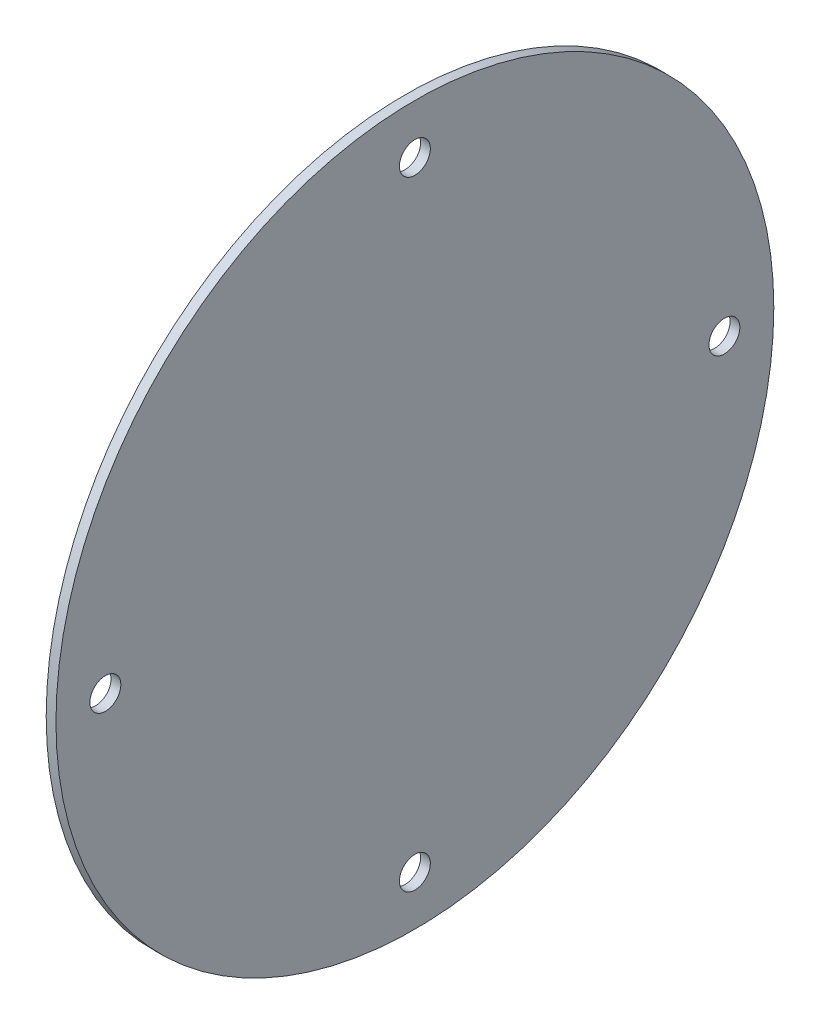
ISO-10303-21;
HEADER;
FILE_DESCRIPTION(('STEP AP214'),'2;1');
FILE_NAME('part.step','',(''),(''),'','','');
FILE_SCHEMA(('AUTOMOTIVE_DESIGN { 1 0 10303 214 1 1 1 1 }'));
ENDSEC;
DATA;
#1=APPLICATION_CONTEXT('core data for automotive mechanical design processes');
#2=APPLICATION_PROTOCOL_DEFINITION('international standard','automotive_design',2000,#1);
#3=PRODUCT_CONTEXT('',#1,'mechanical');
#4=PRODUCT('Part','Part','',(#3));
#5=PRODUCT_RELATED_PRODUCT_CATEGORY('part','',(#4));
#6=PRODUCT_DEFINITION_FORMATION('','',#4);
#7=PRODUCT_DEFINITION_CONTEXT('part definition',#1,'design');
#8=PRODUCT_DEFINITION('design','',#6,#7);
#9=PRODUCT_DEFINITION_SHAPE('','',#8);
#10=(LENGTH_UNIT() NAMED_UNIT(*) SI_UNIT(.MILLI.,.METRE.));
#11=(NAMED_UNIT(*) PLANE_ANGLE_UNIT() SI_UNIT($,.RADIAN.));
#12=(NAMED_UNIT(*) SI_UNIT($,.STERADIAN.) SOLID_ANGLE_UNIT());
#13=UNCERTAINTY_MEASURE_WITH_UNIT(LENGTH_MEASURE(1.E-05),#10,'distance_accuracy_value','');
#14=(GEOMETRIC_REPRESENTATION_CONTEXT(3) GLOBAL_UNCERTAINTY_ASSIGNED_CONTEXT((#13)) GLOBAL_UNIT_ASSIGNED_CONTEXT((#10,
#11,#12)) REPRESENTATION_CONTEXT('',''));
#15=CARTESIAN_POINT('',(0.,0.,0.));
#16=DIRECTION('',(0.,0.,1.));
#17=DIRECTION('',(1.,0.,0.));
#18=AXIS2_PLACEMENT_3D('',#15,#16,#17);
#19=CARTESIAN_POINT('',(2.0066,0.,0.));
#20=DIRECTION('',(-1.,0.,0.));
#21=DIRECTION('',(0.,0.,1.));
#22=AXIS2_PLACEMENT_3D('',#19,#20,#21);
#23=CYLINDRICAL_SURFACE('',#22,73.787);
#24=CARTESIAN_POINT('',(2.0066,0.,0.));
#25=DIRECTION('',(1.,0.,0.));
#26=DIRECTION('',(0.,0.,-1.));
#27=AXIS2_PLACEMENT_3D('',#24,#25,#26);
#28=CIRCLE('',#27,73.787);
#29=CARTESIAN_POINT('',(2.0066,0.,-73.787));
#30=VERTEX_POINT('',#29);
#31=EDGE_CURVE('E10',#30,#30,#28,.T.);
#32=ORIENTED_EDGE('',*,*,#31,.F.);
#33=EDGE_LOOP('',(#32));
#34=FACE_BOUND('',#33,.T.);
#35=CARTESIAN_POINT('',(0.,0.,0.));
#36=DIRECTION('',(1.,0.,0.));
#37=DIRECTION('',(0.,0.,-1.));
#38=AXIS2_PLACEMENT_3D('',#35,#36,#37);
#39=CIRCLE('',#38,73.787);
#40=CARTESIAN_POINT('',(0.,0.,-73.787));
#41=VERTEX_POINT('',#40);
#42=EDGE_CURVE('E45',#41,#41,#39,.T.);
#43=ORIENTED_EDGE('',*,*,#42,.T.);
#44=EDGE_LOOP('',(#43));
#45=FACE_BOUND('',#44,.T.);
#46=ADVANCED_FACE('F42',(#34,#45),#23,.T.);
#47=CARTESIAN_POINT('',(2.0066,0.,0.));
#48=DIRECTION('',(1.,0.,0.));
#49=DIRECTION('',(0.,0.,-1.));
#50=AXIS2_PLACEMENT_3D('',#47,#48,#49);
#51=PLANE('',#50);
#52=CARTESIAN_POINT('',(2.0066,-63.627,-2.22152483146572E-13));
#53=DIRECTION('',(1.,0.,0.));
#54=DIRECTION('',(0.,1.,0.));
#55=AXIS2_PLACEMENT_3D('',#52,#53,#54);
#56=CIRCLE('',#55,3.175);
#57=CARTESIAN_POINT('',(2.0066,-60.452,-2.11067029895745E-13));
#58=VERTEX_POINT('',#57);
#59=EDGE_CURVE('E80',#58,#58,#56,.T.);
#60=ORIENTED_EDGE('',*,*,#59,.F.);
#61=EDGE_LOOP('',(#60));
#62=FACE_BOUND('',#61,.T.);
#63=CARTESIAN_POINT('',(2.0066,0.,-63.627));
#64=DIRECTION('',(1.,0.,0.));
#65=DIRECTION('',(0.,0.,1.));
#66=AXIS2_PLACEMENT_3D('',#63,#64,#65);
#67=CIRCLE('',#66,3.175);
#68=CARTESIAN_POINT('',(2.0066,0.,-60.452));
#69=VERTEX_POINT('',#68);
#70=EDGE_CURVE('E72',#69,#69,#67,.T.);
#71=ORIENTED_EDGE('',*,*,#70,.F.);
#72=EDGE_LOOP('',(#71));
#73=FACE_BOUND('',#72,.T.);
#74=CARTESIAN_POINT('',(2.0066,63.627,6.66457449439716E-13));
#75=DIRECTION('',(1.,0.,0.));
#76=DIRECTION('',(0.,-1.,0.));
#77=AXIS2_PLACEMENT_3D('',#74,#75,#76);
#78=CIRCLE('',#77,3.175);
#79=CARTESIAN_POINT('',(2.0066,60.452,6.33201089687235E-13));
#80=VERTEX_POINT('',#79);
#81=EDGE_CURVE('E64',#80,#80,#78,.T.);
#82=ORIENTED_EDGE('',*,*,#81,.F.);
#83=EDGE_LOOP('',(#82));
#84=FACE_BOUND('',#83,.T.);
#85=CARTESIAN_POINT('',(2.0066,0.,63.627));
#86=DIRECTION('',(1.,0.,0.));
#87=DIRECTION('',(0.,0.,-1.));
#88=AXIS2_PLACEMENT_3D('',#85,#86,#87);
#89=CIRCLE('',#88,3.175);
#90=CARTESIAN_POINT('',(2.0066,0.,60.452));
#91=VERTEX_POINT('',#90);
#92=EDGE_CURVE('E56',#91,#91,#89,.T.);
#93=ORIENTED_EDGE('',*,*,#92,.F.);
#94=EDGE_LOOP('',(#93));
#95=FACE_BOUND('',#94,.T.);
#96=ORIENTED_EDGE('',*,*,#31,.T.);
#97=EDGE_LOOP('',(#96));
#98=FACE_BOUND('',#97,.T.);
#99=ADVANCED_FACE('F98',(#62,#73,#84,#95,#98),#51,.T.);
#100=CARTESIAN_POINT('',(0.,0.,0.));
#101=DIRECTION('',(1.,0.,0.));
#102=DIRECTION('',(0.,0.,-1.));
#103=AXIS2_PLACEMENT_3D('',#100,#101,#102);
#104=PLANE('',#103);
#105=CARTESIAN_POINT('',(0.,-63.627,-2.22152483146572E-13));
#106=DIRECTION('',(1.,0.,0.));
#107=DIRECTION('',(0.,1.,0.));
#108=AXIS2_PLACEMENT_3D('',#105,#106,#107);
#109=CIRCLE('',#108,3.175);
#110=CARTESIAN_POINT('',(0.,-60.452,-2.11067029895745E-13));
#111=VERTEX_POINT('',#110);
#112=EDGE_CURVE('E60',#111,#111,#109,.T.);
#113=ORIENTED_EDGE('',*,*,#112,.T.);
#114=EDGE_LOOP('',(#113));
#115=FACE_BOUND('',#114,.T.);
#116=CARTESIAN_POINT('',(0.,0.,-63.627));
#117=DIRECTION('',(1.,0.,0.));
#118=DIRECTION('',(0.,0.,1.));
#119=AXIS2_PLACEMENT_3D('',#116,#117,#118);
#120=CIRCLE('',#119,3.175);
#121=CARTESIAN_POINT('',(0.,0.,-60.452));
#122=VERTEX_POINT('',#121);
#123=EDGE_CURVE('E76',#122,#122,#120,.T.);
#124=ORIENTED_EDGE('',*,*,#123,.T.);
#125=EDGE_LOOP('',(#124));
#126=FACE_BOUND('',#125,.T.);
#127=CARTESIAN_POINT('',(0.,63.627,6.66457449439716E-13));
#128=DIRECTION('',(1.,0.,0.));
#129=DIRECTION('',(0.,-1.,0.));
#130=AXIS2_PLACEMENT_3D('',#127,#128,#129);
#131=CIRCLE('',#130,3.175);
#132=CARTESIAN_POINT('',(0.,60.452,6.33201089687235E-13));
#133=VERTEX_POINT('',#132);
#134=EDGE_CURVE('E68',#133,#133,#131,.T.);
#135=ORIENTED_EDGE('',*,*,#134,.T.);
#136=EDGE_LOOP('',(#135));
#137=FACE_BOUND('',#136,.T.);
#138=CARTESIAN_POINT('',(0.,0.,63.627));
#139=DIRECTION('',(1.,0.,0.));
#140=DIRECTION('',(0.,0.,-1.));
#141=AXIS2_PLACEMENT_3D('',#138,#139,#140);
#142=CIRCLE('',#141,3.175);
#143=CARTESIAN_POINT('',(0.,0.,60.452));
#144=VERTEX_POINT('',#143);
#145=EDGE_CURVE('E54',#144,#144,#142,.T.);
#146=ORIENTED_EDGE('',*,*,#145,.T.);
#147=EDGE_LOOP('',(#146));
#148=FACE_BOUND('',#147,.T.);
#149=ORIENTED_EDGE('',*,*,#42,.F.);
#150=EDGE_LOOP('',(#149));
#151=FACE_BOUND('',#150,.T.);
#152=ADVANCED_FACE('F88',(#115,#126,#137,#148,#151),#104,.F.);
#153=CARTESIAN_POINT('',(0.,0.,63.627));
#154=DIRECTION('',(1.,0.,0.));
#155=DIRECTION('',(0.,0.,-1.));
#156=AXIS2_PLACEMENT_3D('',#153,#154,#155);
#157=CYLINDRICAL_SURFACE('',#156,3.175);
#158=ORIENTED_EDGE('',*,*,#145,.F.);
#159=EDGE_LOOP('',(#158));
#160=FACE_BOUND('',#159,.T.);
#161=ORIENTED_EDGE('',*,*,#92,.T.);
#162=EDGE_LOOP('',(#161));
#163=FACE_BOUND('',#162,.T.);
#164=ADVANCED_FACE('F108',(#160,#163),#157,.F.);
#165=CARTESIAN_POINT('',(0.,63.627,6.66457449439716E-13));
#166=DIRECTION('',(1.,0.,0.));
#167=DIRECTION('',(0.,0.,-1.));
#168=AXIS2_PLACEMENT_3D('',#165,#166,#167);
#169=CYLINDRICAL_SURFACE('',#168,3.175);
#170=ORIENTED_EDGE('',*,*,#134,.F.);
#171=EDGE_LOOP('',(#170));
#172=FACE_BOUND('',#171,.T.);
#173=ORIENTED_EDGE('',*,*,#81,.T.);
#174=EDGE_LOOP('',(#173));
#175=FACE_BOUND('',#174,.T.);
#176=ADVANCED_FACE('F110',(#172,#175),#169,.F.);
#177=CARTESIAN_POINT('',(0.,0.,-63.627));
#178=DIRECTION('',(1.,0.,0.));
#179=DIRECTION('',(0.,0.,-1.));
#180=AXIS2_PLACEMENT_3D('',#177,#178,#179);
#181=CYLINDRICAL_SURFACE('',#180,3.175);
#182=ORIENTED_EDGE('',*,*,#123,.F.);
#183=EDGE_LOOP('',(#182));
#184=FACE_BOUND('',#183,.T.);
#185=ORIENTED_EDGE('',*,*,#70,.T.);
#186=EDGE_LOOP('',(#185));
#187=FACE_BOUND('',#186,.T.);
#188=ADVANCED_FACE('F94',(#184,#187),#181,.F.);
#189=CARTESIAN_POINT('',(0.,-63.627,-2.22152483146572E-13));
#190=DIRECTION('',(1.,0.,0.));
#191=DIRECTION('',(0.,0.,-1.));
#192=AXIS2_PLACEMENT_3D('',#189,#190,#191);
#193=CYLINDRICAL_SURFACE('',#192,3.175);
#194=ORIENTED_EDGE('',*,*,#112,.F.);
#195=EDGE_LOOP('',(#194));
#196=FACE_BOUND('',#195,.T.);
#197=ORIENTED_EDGE('',*,*,#59,.T.);
#198=EDGE_LOOP('',(#197));
#199=FACE_BOUND('',#198,.T.);
#200=ADVANCED_FACE('F91',(#196,#199),#193,.F.);
#201=CLOSED_SHELL('',(#46,#99,#152,#164,#176,#188,#200));
#202=MANIFOLD_SOLID_BREP('B2',#201);
#203=ADVANCED_BREP_SHAPE_REPRESENTATION('',(#18,#202),#14);
#204=SHAPE_DEFINITION_REPRESENTATION(#9,#203);
ENDSEC;
END-ISO-10303-21;
